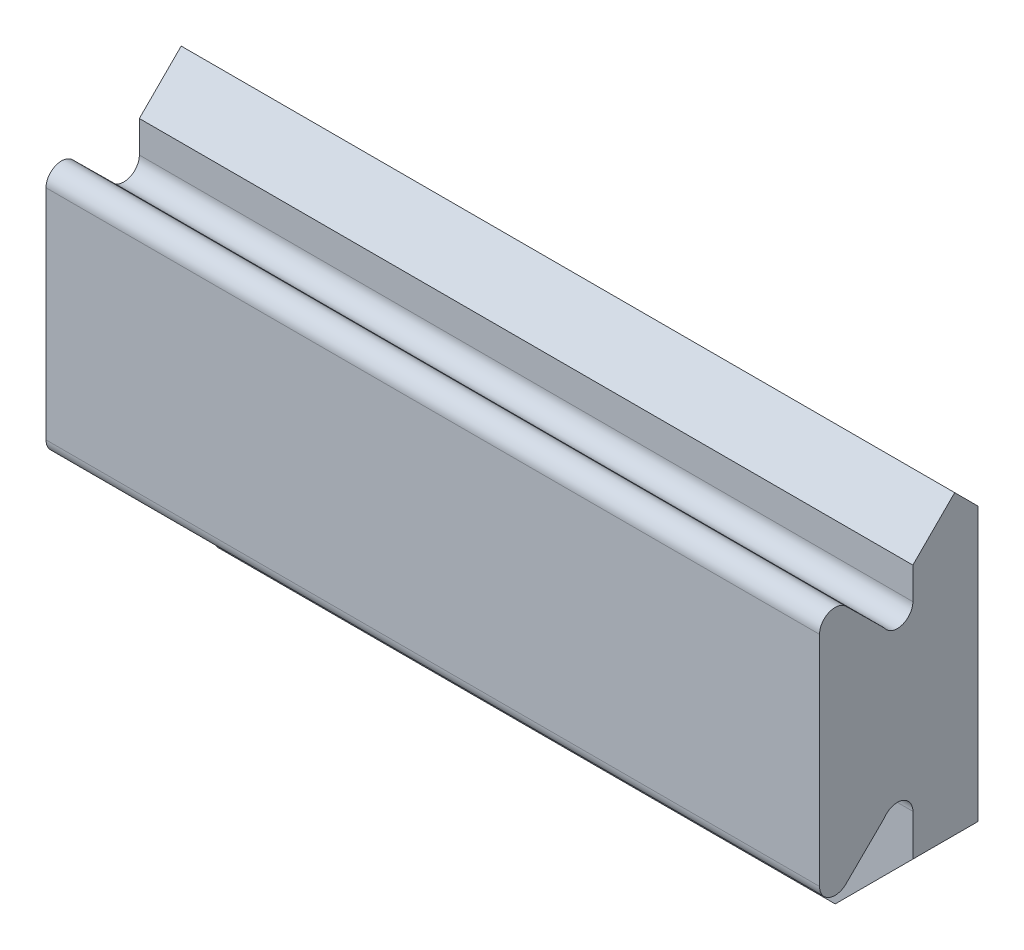
ISO-10303-21;
HEADER;
FILE_DESCRIPTION(('STEP AP214'),'2;1');
FILE_NAME('part.step','',(''),(''),'','','');
FILE_SCHEMA(('AUTOMOTIVE_DESIGN { 1 0 10303 214 1 1 1 1 }'));
ENDSEC;
DATA;
#1=APPLICATION_CONTEXT('core data for automotive mechanical design processes');
#2=APPLICATION_PROTOCOL_DEFINITION('international standard','automotive_design',2000,#1);
#3=PRODUCT_CONTEXT('',#1,'mechanical');
#4=PRODUCT('Part','Part','',(#3));
#5=PRODUCT_RELATED_PRODUCT_CATEGORY('part','',(#4));
#6=PRODUCT_DEFINITION_FORMATION('','',#4);
#7=PRODUCT_DEFINITION_CONTEXT('part definition',#1,'design');
#8=PRODUCT_DEFINITION('design','',#6,#7);
#9=PRODUCT_DEFINITION_SHAPE('','',#8);
#10=(LENGTH_UNIT() NAMED_UNIT(*) SI_UNIT(.MILLI.,.METRE.));
#11=(NAMED_UNIT(*) PLANE_ANGLE_UNIT() SI_UNIT($,.RADIAN.));
#12=(NAMED_UNIT(*) SI_UNIT($,.STERADIAN.) SOLID_ANGLE_UNIT());
#13=UNCERTAINTY_MEASURE_WITH_UNIT(LENGTH_MEASURE(1.E-05),#10,'distance_accuracy_value','');
#14=(GEOMETRIC_REPRESENTATION_CONTEXT(3) GLOBAL_UNCERTAINTY_ASSIGNED_CONTEXT((#13)) GLOBAL_UNIT_ASSIGNED_CONTEXT((#10,
#11,#12)) REPRESENTATION_CONTEXT('',''));
#15=CARTESIAN_POINT('',(0.,0.,0.));
#16=DIRECTION('',(0.,0.,1.));
#17=DIRECTION('',(1.,0.,0.));
#18=AXIS2_PLACEMENT_3D('',#15,#16,#17);
#19=CARTESIAN_POINT('',(49.8,4.91937355973786,-4.91936542565127));
#20=DIRECTION('',(0.,-0.707107365780307,0.707106196592305));
#21=DIRECTION('',(0.,-0.707106196592305,-0.707107365780307));
#22=AXIS2_PLACEMENT_3D('',#19,#20,#21);
#23=PLANE('',#22);
#24=DIRECTION('',(0.,0.707106196592305,0.707107365780307));
#25=VECTOR('',#24,1.);
#26=CARTESIAN_POINT('',(49.8,4.91937355973786,-4.91936542565127));
#27=LINE('',#26,#25);
#28=CARTESIAN_POINT('',(49.8,13.946960064597,4.10823600616778));
#29=VERTEX_POINT('',#28);
#30=CARTESIAN_POINT('',(49.8,15.4469575843768,5.60823600616778));
#31=VERTEX_POINT('',#30);
#32=EDGE_CURVE('E167',#29,#31,#27,.T.);
#33=ORIENTED_EDGE('',*,*,#32,.F.);
#34=DIRECTION('',(1.,0.,0.));
#35=VECTOR('',#34,1.);
#36=CARTESIAN_POINT('',(0.,13.946960064597,4.10823600616778));
#37=LINE('',#36,#35);
#38=CARTESIAN_POINT('',(0.,13.946960064597,4.10823600616778));
#39=VERTEX_POINT('',#38);
#40=EDGE_CURVE('E154',#39,#29,#37,.T.);
#41=ORIENTED_EDGE('',*,*,#40,.F.);
#42=DIRECTION('',(0.,0.707106196592305,0.707107365780307));
#43=VECTOR('',#42,1.);
#44=CARTESIAN_POINT('',(0.,4.91937355973786,-4.91936542565127));
#45=LINE('',#44,#43);
#46=CARTESIAN_POINT('',(0.,15.4469575843768,5.60823600616778));
#47=VERTEX_POINT('',#46);
#48=EDGE_CURVE('E165',#39,#47,#45,.T.);
#49=ORIENTED_EDGE('',*,*,#48,.T.);
#50=DIRECTION('',(-1.,0.,0.));
#51=VECTOR('',#50,1.);
#52=CARTESIAN_POINT('',(49.8,15.4469575843768,5.60823600616778));
#53=LINE('',#52,#51);
#54=EDGE_CURVE('E228',#31,#47,#53,.T.);
#55=ORIENTED_EDGE('',*,*,#54,.F.);
#56=EDGE_LOOP('',(#33,#41,#49,#55));
#57=FACE_BOUND('',#56,.T.);
#58=ADVANCED_FACE('F44',(#57),#23,.F.);
#59=CARTESIAN_POINT('',(49.8,10.5275858544983,10.527600767466));
#60=DIRECTION('',(0.,0.707106280356775,0.707107282015965));
#61=DIRECTION('',(0.,-0.707107282015965,0.707106280356775));
#62=AXIS2_PLACEMENT_3D('',#59,#60,#61);
#63=PLANE('',#62);
#64=DIRECTION('',(0.,0.707107282015965,-0.707106280356775));
#65=VECTOR('',#64,1.);
#66=CARTESIAN_POINT('',(0.,10.5275858544983,10.527600767466));
#67=LINE('',#66,#65);
#68=CARTESIAN_POINT('',(0.,12.7540254554705,8.30116432037675));
#69=VERTEX_POINT('',#68);
#70=EDGE_CURVE('E173',#69,#47,#67,.T.);
#71=ORIENTED_EDGE('',*,*,#70,.F.);
#72=DIRECTION('',(-1.,0.,0.));
#73=VECTOR('',#72,1.);
#74=CARTESIAN_POINT('',(49.8,12.7540254554705,8.30116432037675));
#75=LINE('',#74,#73);
#76=CARTESIAN_POINT('',(49.8,12.7540254554705,8.30116432037675));
#77=VERTEX_POINT('',#76);
#78=EDGE_CURVE('E226',#77,#69,#75,.T.);
#79=ORIENTED_EDGE('',*,*,#78,.F.);
#80=DIRECTION('',(0.,0.707107282015965,-0.707106280356775));
#81=VECTOR('',#80,1.);
#82=CARTESIAN_POINT('',(49.8,10.5275858544983,10.527600767466));
#83=LINE('',#82,#81);
#84=EDGE_CURVE('E253',#77,#31,#83,.T.);
#85=ORIENTED_EDGE('',*,*,#84,.T.);
#86=ORIENTED_EDGE('',*,*,#54,.T.);
#87=EDGE_LOOP('',(#71,#79,#85,#86));
#88=FACE_BOUND('',#87,.T.);
#89=ADVANCED_FACE('F294',(#88),#63,.T.);
#90=CARTESIAN_POINT('',(49.8,0.,8.30116432037677));
#91=DIRECTION('',(0.,0.,1.));
#92=DIRECTION('',(0.,-1.,0.));
#93=AXIS2_PLACEMENT_3D('',#90,#91,#92);
#94=PLANE('',#93);
#95=DIRECTION('',(0.,1.,0.));
#96=VECTOR('',#95,1.);
#97=CARTESIAN_POINT('',(0.,0.,8.30116432037677));
#98=LINE('',#97,#96);
#99=CARTESIAN_POINT('',(0.,10.715261544137,8.30116432037676));
#100=VERTEX_POINT('',#99);
#101=EDGE_CURVE('E175',#100,#69,#98,.T.);
#102=ORIENTED_EDGE('',*,*,#101,.F.);
#103=DIRECTION('',(-1.,0.,0.));
#104=VECTOR('',#103,1.);
#105=CARTESIAN_POINT('',(49.8,10.715261544137,8.30116432037676));
#106=LINE('',#105,#104);
#107=CARTESIAN_POINT('',(49.8,10.715261544137,8.30116432037676));
#108=VERTEX_POINT('',#107);
#109=EDGE_CURVE('E224',#108,#100,#106,.T.);
#110=ORIENTED_EDGE('',*,*,#109,.F.);
#111=DIRECTION('',(0.,1.,0.));
#112=VECTOR('',#111,1.);
#113=CARTESIAN_POINT('',(49.8,0.,8.30116432037677));
#114=LINE('',#113,#112);
#115=EDGE_CURVE('E256',#108,#77,#114,.T.);
#116=ORIENTED_EDGE('',*,*,#115,.T.);
#117=ORIENTED_EDGE('',*,*,#78,.T.);
#118=EDGE_LOOP('',(#102,#110,#116,#117));
#119=FACE_BOUND('',#118,.T.);
#120=ADVANCED_FACE('F299',(#119),#94,.T.);
#121=CARTESIAN_POINT('',(49.8,10.715261544137,9.30115780083639));
#122=DIRECTION('',(-1.,0.,0.));
#123=DIRECTION('',(0.,0.,1.));
#124=AXIS2_PLACEMENT_3D('',#121,#122,#123);
#125=CYLINDRICAL_SURFACE('',#124,0.999993480459637);
#126=CARTESIAN_POINT('',(0.,10.715261544137,9.30115780083639));
#127=DIRECTION('',(1.,0.,0.));
#128=DIRECTION('',(0.,0.,-1.));
#129=AXIS2_PLACEMENT_3D('',#126,#127,#128);
#130=CIRCLE('',#129,0.999993480459637);
#131=CARTESIAN_POINT('',(0.,10.1647499923209,10.1359775372339));
#132=VERTEX_POINT('',#131);
#133=EDGE_CURVE('E183',#132,#100,#130,.T.);
#134=ORIENTED_EDGE('',*,*,#133,.F.);
#135=DIRECTION('',(-1.,0.,0.));
#136=VECTOR('',#135,1.);
#137=CARTESIAN_POINT('',(49.8,10.1647499923209,10.1359775372339));
#138=LINE('',#137,#136);
#139=CARTESIAN_POINT('',(49.8,10.1647499923209,10.1359775372339));
#140=VERTEX_POINT('',#139);
#141=EDGE_CURVE('E222',#140,#132,#138,.T.);
#142=ORIENTED_EDGE('',*,*,#141,.F.);
#143=CARTESIAN_POINT('',(49.8,10.715261544137,9.30115780083639));
#144=DIRECTION('',(1.,0.,0.));
#145=DIRECTION('',(0.,0.,-1.));
#146=AXIS2_PLACEMENT_3D('',#143,#144,#145);
#147=CIRCLE('',#146,0.999993480459637);
#148=EDGE_CURVE('E259',#140,#108,#147,.T.);
#149=ORIENTED_EDGE('',*,*,#148,.T.);
#150=ORIENTED_EDGE('',*,*,#109,.T.);
#151=EDGE_LOOP('',(#134,#142,#149,#150));
#152=FACE_BOUND('',#151,.T.);
#153=ADVANCED_FACE('F337',(#152),#125,.F.);
#154=CARTESIAN_POINT('',(49.8,0.0745524709466737,-0.0736801546399726));
#155=DIRECTION('',(0.,-0.711255633122719,0.702933442333768));
#156=DIRECTION('',(0.,-0.702933442333768,-0.711255633122719));
#157=AXIS2_PLACEMENT_3D('',#154,#155,#156);
#158=PLANE('',#157);
#159=DIRECTION('',(0.,0.702933442333768,0.711255633122719));
#160=VECTOR('',#159,1.);
#161=CARTESIAN_POINT('',(0.,0.0745524709466737,-0.0736801546399726));
#162=LINE('',#161,#160);
#163=CARTESIAN_POINT('',(0.,12.6044130287127,12.60452430575));
#164=VERTEX_POINT('',#163);
#165=EDGE_CURVE('E186',#132,#164,#162,.T.);
#166=ORIENTED_EDGE('',*,*,#165,.T.);
#167=DIRECTION('',(-1.,0.,0.));
#168=VECTOR('',#167,1.);
#169=CARTESIAN_POINT('',(49.8,12.6044130287127,12.60452430575));
#170=LINE('',#169,#168);
#171=CARTESIAN_POINT('',(49.8,12.6044130287127,12.60452430575));
#172=VERTEX_POINT('',#171);
#173=EDGE_CURVE('E219',#172,#164,#170,.T.);
#174=ORIENTED_EDGE('',*,*,#173,.F.);
#175=DIRECTION('',(0.,0.702933442333768,0.711255633122719));
#176=VECTOR('',#175,1.);
#177=CARTESIAN_POINT('',(49.8,0.0745524709466737,-0.0736801546399726));
#178=LINE('',#177,#176);
#179=EDGE_CURVE('E262',#140,#172,#178,.T.);
#180=ORIENTED_EDGE('',*,*,#179,.F.);
#181=ORIENTED_EDGE('',*,*,#141,.T.);
#182=EDGE_LOOP('',(#166,#174,#180,#181));
#183=FACE_BOUND('',#182,.T.);
#184=ADVANCED_FACE('F333',(#183),#158,.F.);
#185=CARTESIAN_POINT('',(49.8,11.8973076845944,13.311632129004));
#186=DIRECTION('',(-1.,0.,0.));
#187=DIRECTION('',(0.,0.,1.));
#188=AXIS2_PLACEMENT_3D('',#185,#186,#187);
#189=CYLINDRICAL_SURFACE('',#188,0.999999720693793);
#190=CARTESIAN_POINT('',(0.,11.8973076845944,13.311632129004));
#191=DIRECTION('',(1.,0.,0.));
#192=DIRECTION('',(0.,0.,-1.));
#193=AXIS2_PLACEMENT_3D('',#190,#191,#192);
#194=CIRCLE('',#193,0.999999720693793);
#195=CARTESIAN_POINT('',(0.,11.8973076845944,14.3116318496977));
#196=VERTEX_POINT('',#195);
#197=EDGE_CURVE('E188',#164,#196,#194,.T.);
#198=ORIENTED_EDGE('',*,*,#197,.T.);
#199=DIRECTION('',(-1.,0.,0.));
#200=VECTOR('',#199,1.);
#201=CARTESIAN_POINT('',(49.8,11.8973076845944,14.3116318496977));
#202=LINE('',#201,#200);
#203=CARTESIAN_POINT('',(49.8,11.8973076845944,14.3116318496977));
#204=VERTEX_POINT('',#203);
#205=EDGE_CURVE('E216',#204,#196,#202,.T.);
#206=ORIENTED_EDGE('',*,*,#205,.F.);
#207=CARTESIAN_POINT('',(49.8,11.8973076845944,13.311632129004));
#208=DIRECTION('',(1.,0.,0.));
#209=DIRECTION('',(0.,0.,-1.));
#210=AXIS2_PLACEMENT_3D('',#207,#208,#209);
#211=CIRCLE('',#210,0.999999720693793);
#212=EDGE_CURVE('E264',#172,#204,#211,.T.);
#213=ORIENTED_EDGE('',*,*,#212,.F.);
#214=ORIENTED_EDGE('',*,*,#173,.T.);
#215=EDGE_LOOP('',(#198,#206,#213,#214));
#216=FACE_BOUND('',#215,.T.);
#217=ADVANCED_FACE('F329',(#216),#189,.T.);
#218=CARTESIAN_POINT('',(49.8,0.,14.3116318496977));
#219=DIRECTION('',(0.,0.,-1.));
#220=DIRECTION('',(-1.,0.,0.));
#221=AXIS2_PLACEMENT_3D('',#218,#219,#220);
#222=PLANE('',#221);
#223=DIRECTION('',(0.,-1.,0.));
#224=VECTOR('',#223,1.);
#225=CARTESIAN_POINT('',(0.,0.,14.3116318496977));
#226=LINE('',#225,#224);
#227=CARTESIAN_POINT('',(0.,-2.15918475216893,14.3116318496977));
#228=VERTEX_POINT('',#227);
#229=EDGE_CURVE('E190',#196,#228,#226,.T.);
#230=ORIENTED_EDGE('',*,*,#229,.T.);
#231=DIRECTION('',(-1.,0.,0.));
#232=VECTOR('',#231,1.);
#233=CARTESIAN_POINT('',(49.8,-2.15918475216893,14.3116318496977));
#234=LINE('',#233,#232);
#235=CARTESIAN_POINT('',(49.8,-2.15918475216893,14.3116318496977));
#236=VERTEX_POINT('',#235);
#237=EDGE_CURVE('E214',#236,#228,#234,.T.);
#238=ORIENTED_EDGE('',*,*,#237,.F.);
#239=DIRECTION('',(0.,-1.,0.));
#240=VECTOR('',#239,1.);
#241=CARTESIAN_POINT('',(49.8,0.,14.3116318496977));
#242=LINE('',#241,#240);
#243=EDGE_CURVE('E266',#204,#236,#242,.T.);
#244=ORIENTED_EDGE('',*,*,#243,.F.);
#245=ORIENTED_EDGE('',*,*,#205,.T.);
#246=EDGE_LOOP('',(#230,#238,#244,#245));
#247=FACE_BOUND('',#246,.T.);
#248=ADVANCED_FACE('F324',(#247),#222,.F.);
#249=CARTESIAN_POINT('',(49.8,-2.15918475216893,13.311632129004));
#250=DIRECTION('',(-1.,0.,0.));
#251=DIRECTION('',(0.,0.,1.));
#252=AXIS2_PLACEMENT_3D('',#249,#250,#251);
#253=CYLINDRICAL_SURFACE('',#252,0.999999720693793);
#254=CARTESIAN_POINT('',(0.,-2.15918475216893,13.311632129004));
#255=DIRECTION('',(1.,0.,0.));
#256=DIRECTION('',(0.,0.,-1.));
#257=AXIS2_PLACEMENT_3D('',#254,#255,#256);
#258=CIRCLE('',#257,0.999999720693793);
#259=CARTESIAN_POINT('',(0.,-2.86629009628729,12.60452430575));
#260=VERTEX_POINT('',#259);
#261=EDGE_CURVE('E193',#260,#228,#258,.F.);
#262=ORIENTED_EDGE('',*,*,#261,.F.);
#263=DIRECTION('',(-1.,0.,0.));
#264=VECTOR('',#263,1.);
#265=CARTESIAN_POINT('',(49.8,-2.86629009628729,12.60452430575));
#266=LINE('',#265,#264);
#267=CARTESIAN_POINT('',(49.8,-2.86629009628729,12.60452430575));
#268=VERTEX_POINT('',#267);
#269=EDGE_CURVE('E212',#268,#260,#266,.T.);
#270=ORIENTED_EDGE('',*,*,#269,.F.);
#271=CARTESIAN_POINT('',(49.8,-2.15918475216893,13.311632129004));
#272=DIRECTION('',(1.,0.,0.));
#273=DIRECTION('',(0.,0.,-1.));
#274=AXIS2_PLACEMENT_3D('',#271,#272,#273);
#275=CIRCLE('',#274,0.999999720693793);
#276=EDGE_CURVE('E268',#268,#236,#275,.F.);
#277=ORIENTED_EDGE('',*,*,#276,.T.);
#278=ORIENTED_EDGE('',*,*,#237,.T.);
#279=EDGE_LOOP('',(#262,#270,#277,#278));
#280=FACE_BOUND('',#279,.T.);
#281=ADVANCED_FACE('F318',(#280),#253,.T.);
#282=CARTESIAN_POINT('',(49.8,4.8518137163392,4.79504408592862));
#283=DIRECTION('',(0.,-0.711255633122719,-0.702933442333768));
#284=DIRECTION('',(0.,0.702933442333768,-0.711255633122719));
#285=AXIS2_PLACEMENT_3D('',#282,#283,#284);
#286=PLANE('',#285);
#287=DIRECTION('',(0.,-0.702933442333768,0.711255633122719));
#288=VECTOR('',#287,1.);
#289=CARTESIAN_POINT('',(0.,4.8518137163392,4.79504408592862));
#290=LINE('',#289,#288);
#291=CARTESIAN_POINT('',(0.,-0.42662705989549,10.1359775372339));
#292=VERTEX_POINT('',#291);
#293=EDGE_CURVE('E196',#292,#260,#290,.T.);
#294=ORIENTED_EDGE('',*,*,#293,.F.);
#295=DIRECTION('',(-1.,0.,0.));
#296=VECTOR('',#295,1.);
#297=CARTESIAN_POINT('',(49.8,-0.42662705989549,10.1359775372339));
#298=LINE('',#297,#296);
#299=CARTESIAN_POINT('',(49.8,-0.42662705989549,10.1359775372339));
#300=VERTEX_POINT('',#299);
#301=EDGE_CURVE('E210',#300,#292,#298,.T.);
#302=ORIENTED_EDGE('',*,*,#301,.F.);
#303=DIRECTION('',(0.,-0.702933442333768,0.711255633122719));
#304=VECTOR('',#303,1.);
#305=CARTESIAN_POINT('',(49.8,4.8518137163392,4.79504408592862));
#306=LINE('',#305,#304);
#307=EDGE_CURVE('E271',#300,#268,#306,.T.);
#308=ORIENTED_EDGE('',*,*,#307,.T.);
#309=ORIENTED_EDGE('',*,*,#269,.T.);
#310=EDGE_LOOP('',(#294,#302,#308,#309));
#311=FACE_BOUND('',#310,.T.);
#312=ADVANCED_FACE('F292',(#311),#286,.T.);
#313=CARTESIAN_POINT('',(49.8,-0.977138611711616,9.30115780083639));
#314=DIRECTION('',(-1.,0.,0.));
#315=DIRECTION('',(0.,0.,1.));
#316=AXIS2_PLACEMENT_3D('',#313,#314,#315);
#317=CYLINDRICAL_SURFACE('',#316,0.999993480459637);
#318=CARTESIAN_POINT('',(0.,-0.977138611711616,9.30115780083639));
#319=DIRECTION('',(1.,0.,0.));
#320=DIRECTION('',(0.,0.,-1.));
#321=AXIS2_PLACEMENT_3D('',#318,#319,#320);
#322=CIRCLE('',#321,0.999993480459637);
#323=CARTESIAN_POINT('',(0.,-0.977138611711616,8.30116432037676));
#324=VERTEX_POINT('',#323);
#325=EDGE_CURVE('E199',#292,#324,#322,.F.);
#326=ORIENTED_EDGE('',*,*,#325,.T.);
#327=DIRECTION('',(-1.,0.,0.));
#328=VECTOR('',#327,1.);
#329=CARTESIAN_POINT('',(49.8,-0.977138611711616,8.30116432037676));
#330=LINE('',#329,#328);
#331=CARTESIAN_POINT('',(49.8,-0.977138611711616,8.30116432037676));
#332=VERTEX_POINT('',#331);
#333=EDGE_CURVE('E207',#332,#324,#330,.T.);
#334=ORIENTED_EDGE('',*,*,#333,.F.);
#335=CARTESIAN_POINT('',(49.8,-0.977138611711616,9.30115780083639));
#336=DIRECTION('',(1.,0.,0.));
#337=DIRECTION('',(0.,0.,-1.));
#338=AXIS2_PLACEMENT_3D('',#335,#336,#337);
#339=CIRCLE('',#338,0.999993480459637);
#340=EDGE_CURVE('E273',#300,#332,#339,.F.);
#341=ORIENTED_EDGE('',*,*,#340,.F.);
#342=ORIENTED_EDGE('',*,*,#301,.T.);
#343=EDGE_LOOP('',(#326,#334,#341,#342));
#344=FACE_BOUND('',#343,.T.);
#345=ADVANCED_FACE('F279',(#344),#317,.F.);
#346=CARTESIAN_POINT('',(49.8,0.,8.30116432037676));
#347=DIRECTION('',(0.,0.,-1.));
#348=DIRECTION('',(0.,1.,0.));
#349=AXIS2_PLACEMENT_3D('',#346,#347,#348);
#350=PLANE('',#349);
#351=DIRECTION('',(0.,-1.,0.));
#352=VECTOR('',#351,1.);
#353=CARTESIAN_POINT('',(0.,0.,8.30116432037676));
#354=LINE('',#353,#352);
#355=CARTESIAN_POINT('',(0.,-3.64091778183414,8.30116432037675));
#356=VERTEX_POINT('',#355);
#357=EDGE_CURVE('E201',#324,#356,#354,.T.);
#358=ORIENTED_EDGE('',*,*,#357,.T.);
#359=DIRECTION('',(-0.707106781186547,0.707106781186549,0.));
#360=VECTOR('',#359,1.);
#361=CARTESIAN_POINT('',(5.00000000000002,-8.64091778183417,8.30116432037675));
#362=LINE('',#361,#360);
#363=CARTESIAN_POINT('',(5.00000000000001,-8.64091778183416,8.30116432037676));
#364=VERTEX_POINT('',#363);
#365=EDGE_CURVE('E238',#356,#364,#362,.F.);
#366=ORIENTED_EDGE('',*,*,#365,.T.);
#367=DIRECTION('',(-1.,0.,0.));
#368=VECTOR('',#367,1.);
#369=CARTESIAN_POINT('',(49.8,-8.64091778183416,8.30116432037676));
#370=LINE('',#369,#368);
#371=CARTESIAN_POINT('',(44.8,-8.64091778183416,8.30116432037676));
#372=VERTEX_POINT('',#371);
#373=EDGE_CURVE('E204',#372,#364,#370,.T.);
#374=ORIENTED_EDGE('',*,*,#373,.F.);
#375=DIRECTION('',(0.707106781186549,0.707106781186547,0.));
#376=VECTOR('',#375,1.);
#377=CARTESIAN_POINT('',(49.8,-3.64091778183416,8.30116432037675));
#378=LINE('',#377,#376);
#379=CARTESIAN_POINT('',(49.8,-3.64091778183416,8.30116432037675));
#380=VERTEX_POINT('',#379);
#381=EDGE_CURVE('E67',#372,#380,#378,.T.);
#382=ORIENTED_EDGE('',*,*,#381,.T.);
#383=DIRECTION('',(0.,-1.,0.));
#384=VECTOR('',#383,1.);
#385=CARTESIAN_POINT('',(49.8,0.,8.30116432037676));
#386=LINE('',#385,#384);
#387=EDGE_CURVE('E179',#332,#380,#386,.T.);
#388=ORIENTED_EDGE('',*,*,#387,.F.);
#389=ORIENTED_EDGE('',*,*,#333,.T.);
#390=EDGE_LOOP('',(#358,#366,#374,#382,#388,#389));
#391=FACE_BOUND('',#390,.T.);
#392=ADVANCED_FACE('F282',(#391),#350,.F.);
#393=CARTESIAN_POINT('',(49.8,-8.64091778183416,0.));
#394=DIRECTION('',(0.,1.,0.));
#395=DIRECTION('',(0.,0.,1.));
#396=AXIS2_PLACEMENT_3D('',#393,#394,#395);
#397=PLANE('',#396);
#398=DIRECTION('',(0.,0.,-1.));
#399=VECTOR('',#398,1.);
#400=CARTESIAN_POINT('',(5.00000000000001,-8.64091778183416,0.));
#401=LINE('',#400,#399);
#402=CARTESIAN_POINT('',(5.00000000000001,-8.64091778183416,4.10823600616777));
#403=VERTEX_POINT('',#402);
#404=EDGE_CURVE('E232',#364,#403,#401,.T.);
#405=ORIENTED_EDGE('',*,*,#404,.T.);
#406=DIRECTION('',(1.,0.,0.));
#407=VECTOR('',#406,1.);
#408=CARTESIAN_POINT('',(0.,-8.64091778183416,4.10823600616777));
#409=LINE('',#408,#407);
#410=CARTESIAN_POINT('',(44.8,-8.64091778183416,4.10823600616777));
#411=VERTEX_POINT('',#410);
#412=EDGE_CURVE('E160',#403,#411,#409,.T.);
#413=ORIENTED_EDGE('',*,*,#412,.T.);
#414=DIRECTION('',(0.,0.,1.));
#415=VECTOR('',#414,1.);
#416=CARTESIAN_POINT('',(44.8,-8.64091778183416,8.30116432037676));
#417=LINE('',#416,#415);
#418=EDGE_CURVE('E230',#411,#372,#417,.T.);
#419=ORIENTED_EDGE('',*,*,#418,.T.);
#420=ORIENTED_EDGE('',*,*,#373,.T.);
#421=EDGE_LOOP('',(#405,#413,#419,#420));
#422=FACE_BOUND('',#421,.T.);
#423=ADVANCED_FACE('F247',(#422),#397,.F.);
#424=CARTESIAN_POINT('',(49.8,0.,0.));
#425=DIRECTION('',(1.,0.,0.));
#426=DIRECTION('',(0.,0.,-1.));
#427=AXIS2_PLACEMENT_3D('',#424,#425,#426);
#428=PLANE('',#427);
#429=DIRECTION('',(0.,-1.,0.));
#430=VECTOR('',#429,1.);
#431=CARTESIAN_POINT('',(49.8,13.946960064597,4.10823600616778));
#432=LINE('',#431,#430);
#433=CARTESIAN_POINT('',(49.8,-3.64091778183416,4.10823600616778));
#434=VERTEX_POINT('',#433);
#435=EDGE_CURVE('E59',#29,#434,#432,.T.);
#436=ORIENTED_EDGE('',*,*,#435,.F.);
#437=ORIENTED_EDGE('',*,*,#32,.T.);
#438=ORIENTED_EDGE('',*,*,#84,.F.);
#439=ORIENTED_EDGE('',*,*,#115,.F.);
#440=ORIENTED_EDGE('',*,*,#148,.F.);
#441=ORIENTED_EDGE('',*,*,#179,.T.);
#442=ORIENTED_EDGE('',*,*,#212,.T.);
#443=ORIENTED_EDGE('',*,*,#243,.T.);
#444=ORIENTED_EDGE('',*,*,#276,.F.);
#445=ORIENTED_EDGE('',*,*,#307,.F.);
#446=ORIENTED_EDGE('',*,*,#340,.T.);
#447=ORIENTED_EDGE('',*,*,#387,.T.);
#448=DIRECTION('',(0.,0.,-1.));
#449=VECTOR('',#448,1.);
#450=CARTESIAN_POINT('',(49.8,-3.64091778183416,3.30116432037676));
#451=LINE('',#450,#449);
#452=EDGE_CURVE('E53',#380,#434,#451,.T.);
#453=ORIENTED_EDGE('',*,*,#452,.T.);
#454=EDGE_LOOP('',(#436,#437,#438,#439,#440,#441,#442,#443,#444,#445,#446,#447,#453));
#455=FACE_BOUND('',#454,.T.);
#456=ADVANCED_FACE('F242',(#455),#428,.T.);
#457=CARTESIAN_POINT('',(0.,0.,0.));
#458=DIRECTION('',(1.,0.,0.));
#459=DIRECTION('',(0.,0.,-1.));
#460=AXIS2_PLACEMENT_3D('',#457,#458,#459);
#461=PLANE('',#460);
#462=ORIENTED_EDGE('',*,*,#48,.F.);
#463=DIRECTION('',(0.,-1.,0.));
#464=VECTOR('',#463,1.);
#465=CARTESIAN_POINT('',(0.,13.946960064597,4.10823600616778));
#466=LINE('',#465,#464);
#467=CARTESIAN_POINT('',(0.,-3.64091778183414,4.10823600616777));
#468=VERTEX_POINT('',#467);
#469=EDGE_CURVE('E151',#39,#468,#466,.T.);
#470=ORIENTED_EDGE('',*,*,#469,.T.);
#471=DIRECTION('',(0.,0.,1.));
#472=VECTOR('',#471,1.);
#473=CARTESIAN_POINT('',(0.,-3.64091778183414,0.));
#474=LINE('',#473,#472);
#475=EDGE_CURVE('E235',#468,#356,#474,.T.);
#476=ORIENTED_EDGE('',*,*,#475,.T.);
#477=ORIENTED_EDGE('',*,*,#357,.F.);
#478=ORIENTED_EDGE('',*,*,#325,.F.);
#479=ORIENTED_EDGE('',*,*,#293,.T.);
#480=ORIENTED_EDGE('',*,*,#261,.T.);
#481=ORIENTED_EDGE('',*,*,#229,.F.);
#482=ORIENTED_EDGE('',*,*,#197,.F.);
#483=ORIENTED_EDGE('',*,*,#165,.F.);
#484=ORIENTED_EDGE('',*,*,#133,.T.);
#485=ORIENTED_EDGE('',*,*,#101,.T.);
#486=ORIENTED_EDGE('',*,*,#70,.T.);
#487=EDGE_LOOP('',(#462,#470,#476,#477,#478,#479,#480,#481,#482,#483,#484,#485,#486));
#488=FACE_BOUND('',#487,.T.);
#489=ADVANCED_FACE('F170',(#488),#461,.F.);
#490=CARTESIAN_POINT('',(5.00000000000001,-8.64091778183416,0.));
#491=DIRECTION('',(0.707106781186549,0.707106781186547,0.));
#492=DIRECTION('',(0.,0.,-1.));
#493=AXIS2_PLACEMENT_3D('',#490,#491,#492);
#494=PLANE('',#493);
#495=DIRECTION('',(0.707106781186547,-0.707106781186549,0.));
#496=VECTOR('',#495,1.);
#497=CARTESIAN_POINT('',(5.00000000000001,-8.64091778183416,4.10823600616777));
#498=LINE('',#497,#496);
#499=EDGE_CURVE('E156',#403,#468,#498,.F.);
#500=ORIENTED_EDGE('',*,*,#499,.F.);
#501=ORIENTED_EDGE('',*,*,#404,.F.);
#502=ORIENTED_EDGE('',*,*,#365,.F.);
#503=ORIENTED_EDGE('',*,*,#475,.F.);
#504=EDGE_LOOP('',(#500,#501,#502,#503));
#505=FACE_BOUND('',#504,.T.);
#506=ADVANCED_FACE('F304',(#505),#494,.F.);
#507=CARTESIAN_POINT('',(49.8,-3.64091778183416,0.));
#508=DIRECTION('',(0.707106781186547,-0.707106781186549,0.));
#509=DIRECTION('',(0.,0.,1.));
#510=AXIS2_PLACEMENT_3D('',#507,#508,#509);
#511=PLANE('',#510);
#512=DIRECTION('',(-0.707106781186549,-0.707106781186547,0.));
#513=VECTOR('',#512,1.);
#514=CARTESIAN_POINT('',(49.8,-3.64091778183416,4.10823600616777));
#515=LINE('',#514,#513);
#516=EDGE_CURVE('E11',#434,#411,#515,.T.);
#517=ORIENTED_EDGE('',*,*,#516,.F.);
#518=ORIENTED_EDGE('',*,*,#452,.F.);
#519=ORIENTED_EDGE('',*,*,#381,.F.);
#520=ORIENTED_EDGE('',*,*,#418,.F.);
#521=EDGE_LOOP('',(#517,#518,#519,#520));
#522=FACE_BOUND('',#521,.T.);
#523=ADVANCED_FACE('F47',(#522),#511,.T.);
#524=CARTESIAN_POINT('',(0.,13.946960064597,4.10823600616778));
#525=DIRECTION('',(0.,0.,1.));
#526=DIRECTION('',(0.,-1.,0.));
#527=AXIS2_PLACEMENT_3D('',#524,#525,#526);
#528=PLANE('',#527);
#529=ORIENTED_EDGE('',*,*,#499,.T.);
#530=ORIENTED_EDGE('',*,*,#469,.F.);
#531=ORIENTED_EDGE('',*,*,#40,.T.);
#532=ORIENTED_EDGE('',*,*,#435,.T.);
#533=ORIENTED_EDGE('',*,*,#516,.T.);
#534=ORIENTED_EDGE('',*,*,#412,.F.);
#535=EDGE_LOOP('',(#529,#530,#531,#532,#533,#534));
#536=FACE_BOUND('',#535,.T.);
#537=ADVANCED_FACE('F153',(#536),#528,.F.);
#538=CLOSED_SHELL('',(#58,#89,#120,#153,#184,#217,#248,#281,#312,#345,#392,#423,#456,#489,#506,
#523,#537));
#539=MANIFOLD_SOLID_BREP('B2',#538);
#540=ADVANCED_BREP_SHAPE_REPRESENTATION('',(#18,#539),#14);
#541=SHAPE_DEFINITION_REPRESENTATION(#9,#540);
ENDSEC;
END-ISO-10303-21;
